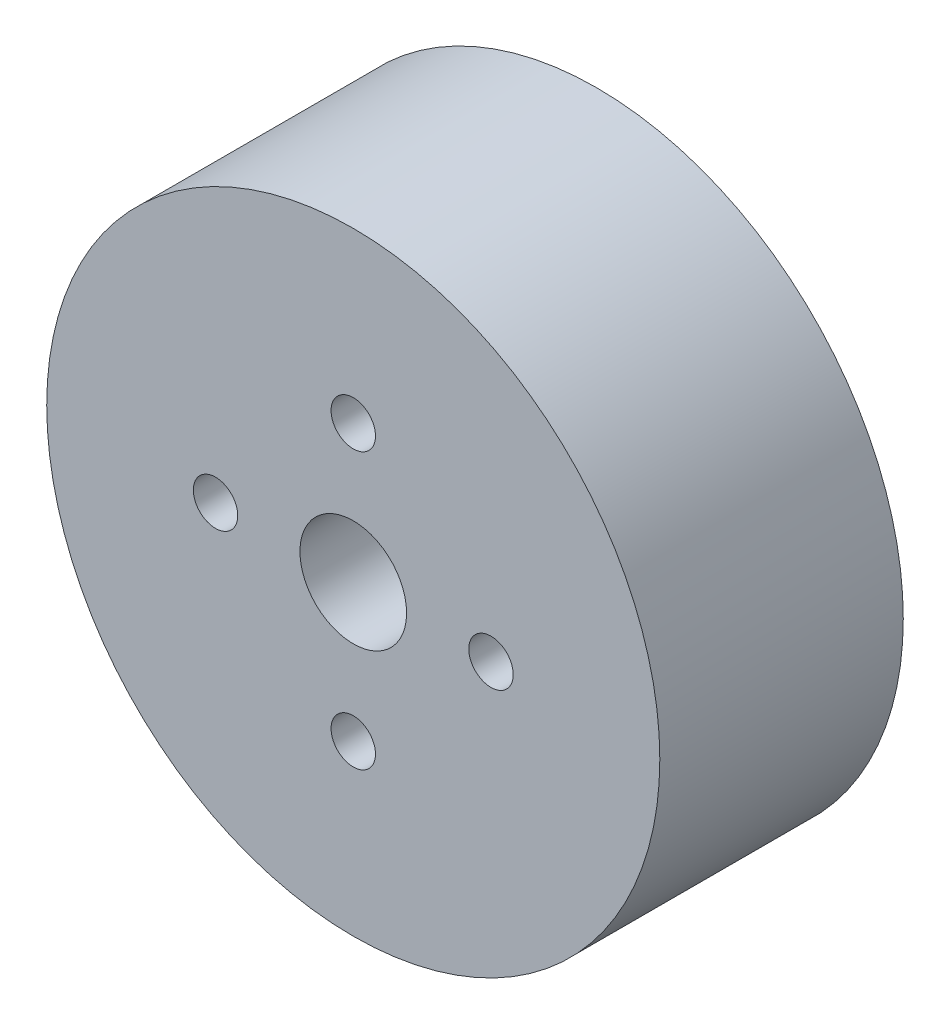
ISO-10303-21;
HEADER;
FILE_DESCRIPTION(('STEP AP214'),'2;1');
FILE_NAME('part.step','',(''),(''),'','','');
FILE_SCHEMA(('AUTOMOTIVE_DESIGN { 1 0 10303 214 1 1 1 1 }'));
ENDSEC;
DATA;
#1=APPLICATION_CONTEXT('core data for automotive mechanical design processes');
#2=APPLICATION_PROTOCOL_DEFINITION('international standard','automotive_design',2000,#1);
#3=PRODUCT_CONTEXT('',#1,'mechanical');
#4=PRODUCT('Part','Part','',(#3));
#5=PRODUCT_RELATED_PRODUCT_CATEGORY('part','',(#4));
#6=PRODUCT_DEFINITION_FORMATION('','',#4);
#7=PRODUCT_DEFINITION_CONTEXT('part definition',#1,'design');
#8=PRODUCT_DEFINITION('design','',#6,#7);
#9=PRODUCT_DEFINITION_SHAPE('','',#8);
#10=(LENGTH_UNIT() NAMED_UNIT(*) SI_UNIT(.MILLI.,.METRE.));
#11=(NAMED_UNIT(*) PLANE_ANGLE_UNIT() SI_UNIT($,.RADIAN.));
#12=(NAMED_UNIT(*) SI_UNIT($,.STERADIAN.) SOLID_ANGLE_UNIT());
#13=UNCERTAINTY_MEASURE_WITH_UNIT(LENGTH_MEASURE(1.E-05),#10,'distance_accuracy_value','');
#14=(GEOMETRIC_REPRESENTATION_CONTEXT(3) GLOBAL_UNCERTAINTY_ASSIGNED_CONTEXT((#13)) GLOBAL_UNIT_ASSIGNED_CONTEXT((#10,
#11,#12)) REPRESENTATION_CONTEXT('',''));
#15=CARTESIAN_POINT('',(0.,0.,0.));
#16=DIRECTION('',(0.,0.,1.));
#17=DIRECTION('',(1.,0.,0.));
#18=AXIS2_PLACEMENT_3D('',#15,#16,#17);
#19=CARTESIAN_POINT('',(0.,0.,13.7));
#20=DIRECTION('',(0.,0.,-1.));
#21=DIRECTION('',(-1.,0.,0.));
#22=AXIS2_PLACEMENT_3D('',#19,#20,#21);
#23=CYLINDRICAL_SURFACE('',#22,17.25);
#24=CARTESIAN_POINT('',(0.,0.,13.7));
#25=DIRECTION('',(0.,0.,1.));
#26=DIRECTION('',(1.,0.,0.));
#27=AXIS2_PLACEMENT_3D('',#24,#25,#26);
#28=CIRCLE('',#27,17.25);
#29=CARTESIAN_POINT('',(-17.25,0.,13.7));
#30=VERTEX_POINT('',#29);
#31=EDGE_CURVE('E63',#30,#30,#28,.T.);
#32=CARTESIAN_POINT('',(0.,0.,0.));
#33=DIRECTION('',(0.,0.,1.));
#34=DIRECTION('',(1.,0.,0.));
#35=AXIS2_PLACEMENT_3D('',#32,#33,#34);
#36=CIRCLE('',#35,17.25);
#37=CARTESIAN_POINT('',(-17.25,0.,0.));
#38=VERTEX_POINT('',#37);
#39=EDGE_CURVE('E64',#38,#38,#36,.T.);
#40=CARTESIAN_POINT('',(-17.25,0.,13.7));
#41=CARTESIAN_POINT('',(-17.25,0.,13.5572916666667));
#42=CARTESIAN_POINT('',(-17.25,0.,13.4145833333333));
#43=CARTESIAN_POINT('',(-17.25,0.,13.1291666666667));
#44=CARTESIAN_POINT('',(-17.25,0.,12.9864583333333));
#45=CARTESIAN_POINT('',(-17.25,0.,12.7010416666667));
#46=CARTESIAN_POINT('',(-17.25,0.,12.5583333333333));
#47=CARTESIAN_POINT('',(-17.25,0.,12.2729166666667));
#48=CARTESIAN_POINT('',(-17.25,0.,12.1302083333333));
#49=CARTESIAN_POINT('',(-17.25,0.,11.8447916666667));
#50=CARTESIAN_POINT('',(-17.25,0.,11.7020833333333));
#51=CARTESIAN_POINT('',(-17.25,0.,11.4166666666667));
#52=CARTESIAN_POINT('',(-17.25,0.,11.2739583333333));
#53=CARTESIAN_POINT('',(-17.25,0.,10.9885416666667));
#54=CARTESIAN_POINT('',(-17.25,0.,10.8458333333333));
#55=CARTESIAN_POINT('',(-17.25,0.,10.5604166666667));
#56=CARTESIAN_POINT('',(-17.25,0.,10.4177083333333));
#57=CARTESIAN_POINT('',(-17.25,0.,10.1322916666667));
#58=CARTESIAN_POINT('',(-17.25,0.,9.98958333333333));
#59=CARTESIAN_POINT('',(-17.25,0.,9.70416666666666));
#60=CARTESIAN_POINT('',(-17.25,0.,9.56145833333333));
#61=CARTESIAN_POINT('',(-17.25,0.,9.27604166666667));
#62=CARTESIAN_POINT('',(-17.25,0.,9.13333333333333));
#63=CARTESIAN_POINT('',(-17.25,0.,8.84791666666666));
#64=CARTESIAN_POINT('',(-17.25,0.,8.70520833333333));
#65=CARTESIAN_POINT('',(-17.25,0.,8.41979166666667));
#66=CARTESIAN_POINT('',(-17.25,0.,8.27708333333333));
#67=CARTESIAN_POINT('',(-17.25,0.,7.99166666666667));
#68=CARTESIAN_POINT('',(-17.25,0.,7.84895833333333));
#69=CARTESIAN_POINT('',(-17.25,0.,7.56354166666667));
#70=CARTESIAN_POINT('',(-17.25,0.,7.42083333333333));
#71=CARTESIAN_POINT('',(-17.25,0.,7.13541666666667));
#72=CARTESIAN_POINT('',(-17.25,0.,6.99270833333333));
#73=CARTESIAN_POINT('',(-17.25,0.,6.70729166666667));
#74=CARTESIAN_POINT('',(-17.25,0.,6.56458333333333));
#75=CARTESIAN_POINT('',(-17.25,0.,6.27916666666667));
#76=CARTESIAN_POINT('',(-17.25,0.,6.13645833333333));
#77=CARTESIAN_POINT('',(-17.25,0.,5.85104166666667));
#78=CARTESIAN_POINT('',(-17.25,0.,5.70833333333333));
#79=CARTESIAN_POINT('',(-17.25,0.,5.42291666666667));
#80=CARTESIAN_POINT('',(-17.25,0.,5.28020833333333));
#81=CARTESIAN_POINT('',(-17.25,0.,4.99479166666667));
#82=CARTESIAN_POINT('',(-17.25,0.,4.85208333333333));
#83=CARTESIAN_POINT('',(-17.25,0.,4.56666666666667));
#84=CARTESIAN_POINT('',(-17.25,0.,4.42395833333333));
#85=CARTESIAN_POINT('',(-17.25,0.,4.13854166666667));
#86=CARTESIAN_POINT('',(-17.25,0.,3.99583333333333));
#87=CARTESIAN_POINT('',(-17.25,0.,3.71041666666667));
#88=CARTESIAN_POINT('',(-17.25,0.,3.56770833333333));
#89=CARTESIAN_POINT('',(-17.25,0.,3.28229166666667));
#90=CARTESIAN_POINT('',(-17.25,0.,3.13958333333333));
#91=CARTESIAN_POINT('',(-17.25,0.,2.85416666666667));
#92=CARTESIAN_POINT('',(-17.25,0.,2.71145833333333));
#93=CARTESIAN_POINT('',(-17.25,0.,2.42604166666667));
#94=CARTESIAN_POINT('',(-17.25,0.,2.28333333333333));
#95=CARTESIAN_POINT('',(-17.25,0.,1.99791666666667));
#96=CARTESIAN_POINT('',(-17.25,0.,1.85520833333333));
#97=CARTESIAN_POINT('',(-17.25,0.,1.56979166666667));
#98=CARTESIAN_POINT('',(-17.25,0.,1.42708333333333));
#99=CARTESIAN_POINT('',(-17.25,0.,1.14166666666667));
#100=CARTESIAN_POINT('',(-17.25,0.,0.998958333333333));
#101=CARTESIAN_POINT('',(-17.25,0.,0.713541666666666));
#102=CARTESIAN_POINT('',(-17.25,0.,0.570833333333333));
#103=CARTESIAN_POINT('',(-17.25,0.,0.285416666666666));
#104=CARTESIAN_POINT('',(-17.25,0.,0.142708333333333));
#105=CARTESIAN_POINT('',(-17.25,0.,0.));
#106=B_SPLINE_CURVE_WITH_KNOTS('',3,(#40,#41,#42,#43,#44,#45,#46,#47,#48,#49,#50,#51,#52,#53,
#54,#55,#56,#57,#58,#59,#60,#61,#62,#63,#64,#65,#66,#67,#68,#69,#70,#71,#72,#73,#74,#75,#76,#77,
#78,#79,#80,#81,#82,#83,#84,#85,#86,#87,#88,#89,#90,#91,#92,#93,#94,#95,#96,#97,#98,#99,#100,
#101,#102,#103,#104,#105),.UNSPECIFIED.,.F.,.F.,(4,2,2,2,2,2,2,2,2,2,2,2,2,2,2,2,2,2,2,2,2,2,2,
2,2,2,2,2,2,2,2,2,4),(0.,0.428125,0.856249999999999,1.284375,1.7125,2.140625,2.56875,2.996875,
3.425,3.853125,4.28125,4.709375,5.1375,5.565625,5.99375,6.421875,6.85,7.278125,7.70625,8.134375,
8.5625,8.990625,9.41875,9.846875,10.275,10.703125,11.13125,11.559375,11.9875,12.415625,12.84375,
13.271875,13.7),.UNSPECIFIED.);
#107=EDGE_CURVE('BSEAM39',#30,#38,#106,.T.);
#108=ORIENTED_EDGE('',*,*,#31,.F.);
#109=ORIENTED_EDGE('',*,*,#39,.T.);
#110=ORIENTED_EDGE('',*,*,#107,.T.);
#111=ORIENTED_EDGE('',*,*,#107,.F.);
#112=EDGE_LOOP('',(#108,#110,#109,#111));
#113=FACE_BOUND('',#112,.T.);
#114=ADVANCED_FACE('F39',(#113),#23,.T.);
#115=CARTESIAN_POINT('',(0.,0.,13.7));
#116=DIRECTION('',(0.,0.,1.));
#117=DIRECTION('',(1.,0.,0.));
#118=AXIS2_PLACEMENT_3D('',#115,#116,#117);
#119=PLANE('',#118);
#120=CARTESIAN_POINT('',(0.,0.,13.7));
#121=DIRECTION('',(0.,0.,1.));
#122=DIRECTION('',(1.,0.,0.));
#123=AXIS2_PLACEMENT_3D('',#120,#121,#122);
#124=CIRCLE('',#123,3.);
#125=CARTESIAN_POINT('',(3.,0.,13.7));
#126=VERTEX_POINT('',#125);
#127=EDGE_CURVE('E152',#126,#126,#124,.T.);
#128=ORIENTED_EDGE('',*,*,#127,.F.);
#129=EDGE_LOOP('',(#128));
#130=FACE_BOUND('',#129,.T.);
#131=CARTESIAN_POINT('',(0.,7.75,13.7));
#132=DIRECTION('',(0.,0.,1.));
#133=DIRECTION('',(1.,0.,0.));
#134=AXIS2_PLACEMENT_3D('',#131,#132,#133);
#135=CIRCLE('',#134,1.25);
#136=CARTESIAN_POINT('',(1.25,7.75,13.7));
#137=VERTEX_POINT('',#136);
#138=EDGE_CURVE('E97',#137,#137,#135,.T.);
#139=ORIENTED_EDGE('',*,*,#138,.F.);
#140=EDGE_LOOP('',(#139));
#141=FACE_BOUND('',#140,.T.);
#142=CARTESIAN_POINT('',(7.75000000000022,2.18844596181622E-13,13.7));
#143=DIRECTION('',(0.,0.,1.));
#144=DIRECTION('',(1.,0.,0.));
#145=AXIS2_PLACEMENT_3D('',#142,#143,#144);
#146=CIRCLE('',#145,1.25000000000017);
#147=CARTESIAN_POINT('',(9.00000000000039,2.18844596181622E-13,13.7));
#148=VERTEX_POINT('',#147);
#149=EDGE_CURVE('E89',#148,#148,#146,.T.);
#150=ORIENTED_EDGE('',*,*,#149,.F.);
#151=EDGE_LOOP('',(#150));
#152=FACE_BOUND('',#151,.T.);
#153=CARTESIAN_POINT('',(4.37689192363245E-13,-7.75,13.7));
#154=DIRECTION('',(0.,0.,1.));
#155=DIRECTION('',(1.,0.,0.));
#156=AXIS2_PLACEMENT_3D('',#153,#154,#155);
#157=CIRCLE('',#156,1.25000000000047);
#158=CARTESIAN_POINT('',(1.25000000000091,-7.75,13.7));
#159=VERTEX_POINT('',#158);
#160=EDGE_CURVE('E81',#159,#159,#157,.T.);
#161=ORIENTED_EDGE('',*,*,#160,.F.);
#162=EDGE_LOOP('',(#161));
#163=FACE_BOUND('',#162,.T.);
#164=CARTESIAN_POINT('',(-7.74999999999978,-2.19793697450961E-13,13.7));
#165=DIRECTION('',(0.,0.,1.));
#166=DIRECTION('',(1.,0.,0.));
#167=AXIS2_PLACEMENT_3D('',#164,#165,#166);
#168=CIRCLE('',#167,1.25000000000035);
#169=CARTESIAN_POINT('',(-6.49999999999943,-2.19793697450961E-13,13.7));
#170=VERTEX_POINT('',#169);
#171=EDGE_CURVE('E72',#170,#170,#168,.T.);
#172=ORIENTED_EDGE('',*,*,#171,.F.);
#173=EDGE_LOOP('',(#172));
#174=FACE_BOUND('',#173,.T.);
#175=ORIENTED_EDGE('',*,*,#31,.T.);
#176=EDGE_LOOP('',(#175));
#177=FACE_BOUND('',#176,.T.);
#178=ADVANCED_FACE('F168',(#130,#141,#152,#163,#174,#177),#119,.T.);
#179=CARTESIAN_POINT('',(0.,0.,0.));
#180=DIRECTION('',(0.,0.,1.));
#181=DIRECTION('',(1.,0.,0.));
#182=AXIS2_PLACEMENT_3D('',#179,#180,#181);
#183=PLANE('',#182);
#184=CARTESIAN_POINT('',(0.,0.,0.));
#185=DIRECTION('',(0.,0.,1.));
#186=DIRECTION('',(1.,0.,0.));
#187=AXIS2_PLACEMENT_3D('',#184,#185,#186);
#188=CIRCLE('',#187,6.25);
#189=CARTESIAN_POINT('',(6.25,0.,0.));
#190=VERTEX_POINT('',#189);
#191=EDGE_CURVE('E136',#190,#190,#188,.T.);
#192=ORIENTED_EDGE('',*,*,#191,.T.);
#193=EDGE_LOOP('',(#192));
#194=FACE_BOUND('',#193,.T.);
#195=CARTESIAN_POINT('',(0.,7.75,0.));
#196=DIRECTION('',(0.,0.,1.));
#197=DIRECTION('',(1.,0.,0.));
#198=AXIS2_PLACEMENT_3D('',#195,#196,#197);
#199=CIRCLE('',#198,1.25);
#200=CARTESIAN_POINT('',(1.25,7.75,0.));
#201=VERTEX_POINT('',#200);
#202=EDGE_CURVE('E129',#201,#201,#199,.T.);
#203=ORIENTED_EDGE('',*,*,#202,.T.);
#204=EDGE_LOOP('',(#203));
#205=FACE_BOUND('',#204,.T.);
#206=CARTESIAN_POINT('',(7.75000000000022,2.18844596181622E-13,0.));
#207=DIRECTION('',(0.,0.,1.));
#208=DIRECTION('',(1.,0.,0.));
#209=AXIS2_PLACEMENT_3D('',#206,#207,#208);
#210=CIRCLE('',#209,1.25);
#211=CARTESIAN_POINT('',(9.00000000000022,2.18844596181622E-13,0.));
#212=VERTEX_POINT('',#211);
#213=EDGE_CURVE('E121',#212,#212,#210,.T.);
#214=ORIENTED_EDGE('',*,*,#213,.T.);
#215=EDGE_LOOP('',(#214));
#216=FACE_BOUND('',#215,.T.);
#217=CARTESIAN_POINT('',(4.37689192363245E-13,-7.75,0.));
#218=DIRECTION('',(0.,0.,1.));
#219=DIRECTION('',(1.,0.,0.));
#220=AXIS2_PLACEMENT_3D('',#217,#218,#219);
#221=CIRCLE('',#220,1.25);
#222=CARTESIAN_POINT('',(1.25000000000044,-7.75,0.));
#223=VERTEX_POINT('',#222);
#224=EDGE_CURVE('E113',#223,#223,#221,.T.);
#225=ORIENTED_EDGE('',*,*,#224,.T.);
#226=EDGE_LOOP('',(#225));
#227=FACE_BOUND('',#226,.T.);
#228=CARTESIAN_POINT('',(-7.74999999999978,-2.19793697450961E-13,0.));
#229=DIRECTION('',(0.,0.,1.));
#230=DIRECTION('',(1.,0.,0.));
#231=AXIS2_PLACEMENT_3D('',#228,#229,#230);
#232=CIRCLE('',#231,1.25);
#233=CARTESIAN_POINT('',(-6.49999999999978,-2.19793697450961E-13,0.));
#234=VERTEX_POINT('',#233);
#235=EDGE_CURVE('E104',#234,#234,#232,.T.);
#236=ORIENTED_EDGE('',*,*,#235,.T.);
#237=EDGE_LOOP('',(#236));
#238=FACE_BOUND('',#237,.T.);
#239=ORIENTED_EDGE('',*,*,#39,.F.);
#240=EDGE_LOOP('',(#239));
#241=FACE_BOUND('',#240,.T.);
#242=ADVANCED_FACE('F171',(#194,#205,#216,#227,#238,#241),#183,.F.);
#243=CARTESIAN_POINT('',(-7.74999999999978,-2.19793697450961E-13,10.7));
#244=DIRECTION('',(0.,0.,1.));
#245=DIRECTION('',(1.,0.,0.));
#246=AXIS2_PLACEMENT_3D('',#243,#244,#245);
#247=CYLINDRICAL_SURFACE('',#246,1.25000000000035);
#248=CARTESIAN_POINT('',(-7.74999999999978,-2.19793697450961E-13,10.7));
#249=DIRECTION('',(0.,0.,1.));
#250=DIRECTION('',(1.,0.,0.));
#251=AXIS2_PLACEMENT_3D('',#248,#249,#250);
#252=CIRCLE('',#251,1.25000000000035);
#253=CARTESIAN_POINT('',(-6.49999999999943,-2.19793697450961E-13,10.7));
#254=VERTEX_POINT('',#253);
#255=EDGE_CURVE('E76',#254,#254,#252,.T.);
#256=ORIENTED_EDGE('',*,*,#255,.F.);
#257=EDGE_LOOP('',(#256));
#258=FACE_BOUND('',#257,.T.);
#259=ORIENTED_EDGE('',*,*,#171,.T.);
#260=EDGE_LOOP('',(#259));
#261=FACE_BOUND('',#260,.T.);
#262=ADVANCED_FACE('F189',(#258,#261),#247,.F.);
#263=CARTESIAN_POINT('',(-7.74999999999978,-2.19793697450961E-13,10.7));
#264=DIRECTION('',(0.,0.,1.));
#265=DIRECTION('',(1.,0.,0.));
#266=AXIS2_PLACEMENT_3D('',#263,#264,#265);
#267=PLANE('',#266);
#268=ORIENTED_EDGE('',*,*,#255,.T.);
#269=EDGE_LOOP('',(#268));
#270=FACE_BOUND('',#269,.T.);
#271=ADVANCED_FACE('F196',(#270),#267,.T.);
#272=CARTESIAN_POINT('',(4.37689192363245E-13,-7.75,10.7));
#273=DIRECTION('',(0.,0.,1.));
#274=DIRECTION('',(1.,0.,0.));
#275=AXIS2_PLACEMENT_3D('',#272,#273,#274);
#276=CYLINDRICAL_SURFACE('',#275,1.25000000000047);
#277=CARTESIAN_POINT('',(4.37689192363245E-13,-7.75,10.7));
#278=DIRECTION('',(0.,0.,1.));
#279=DIRECTION('',(1.,0.,0.));
#280=AXIS2_PLACEMENT_3D('',#277,#278,#279);
#281=CIRCLE('',#280,1.25000000000047);
#282=CARTESIAN_POINT('',(1.25000000000091,-7.75,10.7));
#283=VERTEX_POINT('',#282);
#284=EDGE_CURVE('E85',#283,#283,#281,.T.);
#285=ORIENTED_EDGE('',*,*,#284,.F.);
#286=EDGE_LOOP('',(#285));
#287=FACE_BOUND('',#286,.T.);
#288=ORIENTED_EDGE('',*,*,#160,.T.);
#289=EDGE_LOOP('',(#288));
#290=FACE_BOUND('',#289,.T.);
#291=ADVANCED_FACE('F292',(#287,#290),#276,.F.);
#292=CARTESIAN_POINT('',(4.37689192363245E-13,-7.75,10.7));
#293=DIRECTION('',(0.,0.,1.));
#294=DIRECTION('',(1.,0.,0.));
#295=AXIS2_PLACEMENT_3D('',#292,#293,#294);
#296=PLANE('',#295);
#297=ORIENTED_EDGE('',*,*,#284,.T.);
#298=EDGE_LOOP('',(#297));
#299=FACE_BOUND('',#298,.T.);
#300=ADVANCED_FACE('F288',(#299),#296,.T.);
#301=CARTESIAN_POINT('',(7.75000000000022,2.18844596181622E-13,10.7));
#302=DIRECTION('',(0.,0.,1.));
#303=DIRECTION('',(1.,0.,0.));
#304=AXIS2_PLACEMENT_3D('',#301,#302,#303);
#305=CYLINDRICAL_SURFACE('',#304,1.25000000000017);
#306=CARTESIAN_POINT('',(7.75000000000022,2.18844596181622E-13,10.7));
#307=DIRECTION('',(0.,0.,1.));
#308=DIRECTION('',(1.,0.,0.));
#309=AXIS2_PLACEMENT_3D('',#306,#307,#308);
#310=CIRCLE('',#309,1.25000000000017);
#311=CARTESIAN_POINT('',(9.00000000000039,2.18844596181622E-13,10.7));
#312=VERTEX_POINT('',#311);
#313=EDGE_CURVE('E93',#312,#312,#310,.T.);
#314=ORIENTED_EDGE('',*,*,#313,.F.);
#315=EDGE_LOOP('',(#314));
#316=FACE_BOUND('',#315,.T.);
#317=ORIENTED_EDGE('',*,*,#149,.T.);
#318=EDGE_LOOP('',(#317));
#319=FACE_BOUND('',#318,.T.);
#320=ADVANCED_FACE('F284',(#316,#319),#305,.F.);
#321=CARTESIAN_POINT('',(7.75000000000022,2.18844596181622E-13,10.7));
#322=DIRECTION('',(0.,0.,1.));
#323=DIRECTION('',(1.,0.,0.));
#324=AXIS2_PLACEMENT_3D('',#321,#322,#323);
#325=PLANE('',#324);
#326=ORIENTED_EDGE('',*,*,#313,.T.);
#327=EDGE_LOOP('',(#326));
#328=FACE_BOUND('',#327,.T.);
#329=ADVANCED_FACE('F280',(#328),#325,.T.);
#330=CARTESIAN_POINT('',(0.,7.75,10.7));
#331=DIRECTION('',(0.,0.,1.));
#332=DIRECTION('',(1.,0.,0.));
#333=AXIS2_PLACEMENT_3D('',#330,#331,#332);
#334=CYLINDRICAL_SURFACE('',#333,1.25);
#335=CARTESIAN_POINT('',(0.,7.75,10.7));
#336=DIRECTION('',(0.,0.,1.));
#337=DIRECTION('',(1.,0.,0.));
#338=AXIS2_PLACEMENT_3D('',#335,#336,#337);
#339=CIRCLE('',#338,1.25);
#340=CARTESIAN_POINT('',(1.25,7.75,10.7));
#341=VERTEX_POINT('',#340);
#342=EDGE_CURVE('E68',#341,#341,#339,.T.);
#343=ORIENTED_EDGE('',*,*,#342,.F.);
#344=EDGE_LOOP('',(#343));
#345=FACE_BOUND('',#344,.T.);
#346=ORIENTED_EDGE('',*,*,#138,.T.);
#347=EDGE_LOOP('',(#346));
#348=FACE_BOUND('',#347,.T.);
#349=ADVANCED_FACE('F276',(#345,#348),#334,.F.);
#350=CARTESIAN_POINT('',(0.,7.75,10.7));
#351=DIRECTION('',(0.,0.,1.));
#352=DIRECTION('',(1.,0.,0.));
#353=AXIS2_PLACEMENT_3D('',#350,#351,#352);
#354=PLANE('',#353);
#355=ORIENTED_EDGE('',*,*,#342,.T.);
#356=EDGE_LOOP('',(#355));
#357=FACE_BOUND('',#356,.T.);
#358=ADVANCED_FACE('F272',(#357),#354,.T.);
#359=CARTESIAN_POINT('',(-7.74999999999978,-2.19793697450961E-13,3.));
#360=DIRECTION('',(0.,0.,-1.));
#361=DIRECTION('',(-1.,0.,0.));
#362=AXIS2_PLACEMENT_3D('',#359,#360,#361);
#363=CYLINDRICAL_SURFACE('',#362,1.25);
#364=CARTESIAN_POINT('',(-7.74999999999978,-2.19793697450961E-13,3.));
#365=DIRECTION('',(0.,0.,1.));
#366=DIRECTION('',(1.,0.,0.));
#367=AXIS2_PLACEMENT_3D('',#364,#365,#366);
#368=CIRCLE('',#367,1.25);
#369=CARTESIAN_POINT('',(-6.49999999999978,-2.19793697450961E-13,3.));
#370=VERTEX_POINT('',#369);
#371=EDGE_CURVE('E108',#370,#370,#368,.T.);
#372=ORIENTED_EDGE('',*,*,#371,.T.);
#373=EDGE_LOOP('',(#372));
#374=FACE_BOUND('',#373,.T.);
#375=ORIENTED_EDGE('',*,*,#235,.F.);
#376=EDGE_LOOP('',(#375));
#377=FACE_BOUND('',#376,.T.);
#378=ADVANCED_FACE('F268',(#374,#377),#363,.F.);
#379=CARTESIAN_POINT('',(-7.74999999999978,-2.19793697450961E-13,3.));
#380=DIRECTION('',(0.,0.,1.));
#381=DIRECTION('',(1.,0.,0.));
#382=AXIS2_PLACEMENT_3D('',#379,#380,#381);
#383=PLANE('',#382);
#384=ORIENTED_EDGE('',*,*,#371,.F.);
#385=EDGE_LOOP('',(#384));
#386=FACE_BOUND('',#385,.T.);
#387=ADVANCED_FACE('F264',(#386),#383,.F.);
#388=CARTESIAN_POINT('',(4.37689192363245E-13,-7.75,3.));
#389=DIRECTION('',(0.,0.,-1.));
#390=DIRECTION('',(-1.,0.,0.));
#391=AXIS2_PLACEMENT_3D('',#388,#389,#390);
#392=CYLINDRICAL_SURFACE('',#391,1.25);
#393=CARTESIAN_POINT('',(4.37689192363245E-13,-7.75,3.));
#394=DIRECTION('',(0.,0.,1.));
#395=DIRECTION('',(1.,0.,0.));
#396=AXIS2_PLACEMENT_3D('',#393,#394,#395);
#397=CIRCLE('',#396,1.25);
#398=CARTESIAN_POINT('',(1.25000000000044,-7.75,3.));
#399=VERTEX_POINT('',#398);
#400=EDGE_CURVE('E117',#399,#399,#397,.T.);
#401=ORIENTED_EDGE('',*,*,#400,.T.);
#402=EDGE_LOOP('',(#401));
#403=FACE_BOUND('',#402,.T.);
#404=ORIENTED_EDGE('',*,*,#224,.F.);
#405=EDGE_LOOP('',(#404));
#406=FACE_BOUND('',#405,.T.);
#407=ADVANCED_FACE('F260',(#403,#406),#392,.F.);
#408=CARTESIAN_POINT('',(4.37689192363245E-13,-7.75,3.));
#409=DIRECTION('',(0.,0.,1.));
#410=DIRECTION('',(1.,0.,0.));
#411=AXIS2_PLACEMENT_3D('',#408,#409,#410);
#412=PLANE('',#411);
#413=ORIENTED_EDGE('',*,*,#400,.F.);
#414=EDGE_LOOP('',(#413));
#415=FACE_BOUND('',#414,.T.);
#416=ADVANCED_FACE('F256',(#415),#412,.F.);
#417=CARTESIAN_POINT('',(7.75000000000022,2.18844596181622E-13,3.));
#418=DIRECTION('',(0.,0.,-1.));
#419=DIRECTION('',(-1.,0.,0.));
#420=AXIS2_PLACEMENT_3D('',#417,#418,#419);
#421=CYLINDRICAL_SURFACE('',#420,1.25);
#422=CARTESIAN_POINT('',(7.75000000000022,2.18844596181622E-13,3.));
#423=DIRECTION('',(0.,0.,1.));
#424=DIRECTION('',(1.,0.,0.));
#425=AXIS2_PLACEMENT_3D('',#422,#423,#424);
#426=CIRCLE('',#425,1.25);
#427=CARTESIAN_POINT('',(9.00000000000022,2.18844596181622E-13,3.));
#428=VERTEX_POINT('',#427);
#429=EDGE_CURVE('E125',#428,#428,#426,.T.);
#430=ORIENTED_EDGE('',*,*,#429,.T.);
#431=EDGE_LOOP('',(#430));
#432=FACE_BOUND('',#431,.T.);
#433=ORIENTED_EDGE('',*,*,#213,.F.);
#434=EDGE_LOOP('',(#433));
#435=FACE_BOUND('',#434,.T.);
#436=ADVANCED_FACE('F252',(#432,#435),#421,.F.);
#437=CARTESIAN_POINT('',(7.75000000000022,2.18844596181622E-13,3.));
#438=DIRECTION('',(0.,0.,1.));
#439=DIRECTION('',(1.,0.,0.));
#440=AXIS2_PLACEMENT_3D('',#437,#438,#439);
#441=PLANE('',#440);
#442=ORIENTED_EDGE('',*,*,#429,.F.);
#443=EDGE_LOOP('',(#442));
#444=FACE_BOUND('',#443,.T.);
#445=ADVANCED_FACE('F248',(#444),#441,.F.);
#446=CARTESIAN_POINT('',(0.,7.75,3.));
#447=DIRECTION('',(0.,0.,-1.));
#448=DIRECTION('',(-1.,0.,0.));
#449=AXIS2_PLACEMENT_3D('',#446,#447,#448);
#450=CYLINDRICAL_SURFACE('',#449,1.25);
#451=CARTESIAN_POINT('',(0.,7.75,3.));
#452=DIRECTION('',(0.,0.,1.));
#453=DIRECTION('',(1.,0.,0.));
#454=AXIS2_PLACEMENT_3D('',#451,#452,#453);
#455=CIRCLE('',#454,1.25);
#456=CARTESIAN_POINT('',(1.25,7.75,3.));
#457=VERTEX_POINT('',#456);
#458=EDGE_CURVE('E77',#457,#457,#455,.T.);
#459=ORIENTED_EDGE('',*,*,#458,.T.);
#460=EDGE_LOOP('',(#459));
#461=FACE_BOUND('',#460,.T.);
#462=ORIENTED_EDGE('',*,*,#202,.F.);
#463=EDGE_LOOP('',(#462));
#464=FACE_BOUND('',#463,.T.);
#465=ADVANCED_FACE('F244',(#461,#464),#450,.F.);
#466=CARTESIAN_POINT('',(0.,7.75,3.));
#467=DIRECTION('',(0.,0.,1.));
#468=DIRECTION('',(1.,0.,0.));
#469=AXIS2_PLACEMENT_3D('',#466,#467,#468);
#470=PLANE('',#469);
#471=ORIENTED_EDGE('',*,*,#458,.F.);
#472=EDGE_LOOP('',(#471));
#473=FACE_BOUND('',#472,.T.);
#474=ADVANCED_FACE('F237',(#473),#470,.F.);
#475=CARTESIAN_POINT('',(0.,0.,2.));
#476=DIRECTION('',(0.,0.,1.));
#477=DIRECTION('',(1.,0.,0.));
#478=AXIS2_PLACEMENT_3D('',#475,#476,#477);
#479=PLANE('',#478);
#480=CARTESIAN_POINT('',(0.,0.,2.));
#481=DIRECTION('',(0.,0.,1.));
#482=DIRECTION('',(1.,0.,0.));
#483=AXIS2_PLACEMENT_3D('',#480,#481,#482);
#484=CIRCLE('',#483,6.25);
#485=CARTESIAN_POINT('',(6.25,0.,2.));
#486=VERTEX_POINT('',#485);
#487=EDGE_CURVE('E109',#486,#486,#484,.T.);
#488=ORIENTED_EDGE('',*,*,#487,.F.);
#489=EDGE_LOOP('',(#488));
#490=FACE_BOUND('',#489,.T.);
#491=CARTESIAN_POINT('',(0.,0.,2.));
#492=DIRECTION('',(0.,0.,1.));
#493=DIRECTION('',(1.,0.,0.));
#494=AXIS2_PLACEMENT_3D('',#491,#492,#493);
#495=CIRCLE('',#494,4.25);
#496=CARTESIAN_POINT('',(4.25,0.,2.));
#497=VERTEX_POINT('',#496);
#498=EDGE_CURVE('E140',#497,#497,#495,.T.);
#499=ORIENTED_EDGE('',*,*,#498,.T.);
#500=EDGE_LOOP('',(#499));
#501=FACE_BOUND('',#500,.T.);
#502=ADVANCED_FACE('F234',(#490,#501),#479,.F.);
#503=CARTESIAN_POINT('',(0.,0.,2.));
#504=DIRECTION('',(0.,0.,-1.));
#505=DIRECTION('',(-1.,0.,0.));
#506=AXIS2_PLACEMENT_3D('',#503,#504,#505);
#507=CYLINDRICAL_SURFACE('',#506,6.25);
#508=ORIENTED_EDGE('',*,*,#487,.T.);
#509=EDGE_LOOP('',(#508));
#510=FACE_BOUND('',#509,.T.);
#511=ORIENTED_EDGE('',*,*,#191,.F.);
#512=EDGE_LOOP('',(#511));
#513=FACE_BOUND('',#512,.T.);
#514=ADVANCED_FACE('F210',(#510,#513),#507,.F.);
#515=CARTESIAN_POINT('',(0.,0.,2.));
#516=DIRECTION('',(0.,0.,-1.));
#517=DIRECTION('',(-1.,0.,0.));
#518=AXIS2_PLACEMENT_3D('',#515,#516,#517);
#519=CYLINDRICAL_SURFACE('',#518,4.25);
#520=CARTESIAN_POINT('',(0.,0.,0.3));
#521=DIRECTION('',(0.,0.,1.));
#522=DIRECTION('',(1.,0.,0.));
#523=AXIS2_PLACEMENT_3D('',#520,#521,#522);
#524=CIRCLE('',#523,4.25);
#525=CARTESIAN_POINT('',(4.25,0.,0.3));
#526=VERTEX_POINT('',#525);
#527=EDGE_CURVE('E10',#526,#526,#524,.T.);
#528=ORIENTED_EDGE('',*,*,#527,.T.);
#529=EDGE_LOOP('',(#528));
#530=FACE_BOUND('',#529,.T.);
#531=ORIENTED_EDGE('',*,*,#498,.F.);
#532=EDGE_LOOP('',(#531));
#533=FACE_BOUND('',#532,.T.);
#534=ADVANCED_FACE('F202',(#530,#533),#519,.T.);
#535=CARTESIAN_POINT('',(0.,0.,0.));
#536=DIRECTION('',(0.,0.,1.));
#537=DIRECTION('',(1.,0.,0.));
#538=AXIS2_PLACEMENT_3D('',#535,#536,#537);
#539=CIRCLE('',#538,3.55);
#540=CARTESIAN_POINT('',(3.55,0.,0.));
#541=VERTEX_POINT('',#540);
#542=EDGE_CURVE('E52',#541,#541,#539,.T.);
#543=ORIENTED_EDGE('',*,*,#542,.T.);
#544=EDGE_LOOP('',(#543));
#545=FACE_BOUND('',#544,.T.);
#546=CARTESIAN_POINT('',(0.,0.,0.));
#547=DIRECTION('',(0.,0.,1.));
#548=DIRECTION('',(1.,0.,0.));
#549=AXIS2_PLACEMENT_3D('',#546,#547,#548);
#550=CIRCLE('',#549,3.95);
#551=CARTESIAN_POINT('',(3.95,0.,0.));
#552=VERTEX_POINT('',#551);
#553=EDGE_CURVE('E57',#552,#552,#550,.F.);
#554=ORIENTED_EDGE('',*,*,#553,.T.);
#555=EDGE_LOOP('',(#554));
#556=FACE_BOUND('',#555,.T.);
#557=ADVANCED_FACE('F192',(#545,#556),#183,.F.);
#558=CARTESIAN_POINT('',(0.,0.,0.7));
#559=DIRECTION('',(0.,0.,-1.));
#560=DIRECTION('',(-1.,0.,0.));
#561=AXIS2_PLACEMENT_3D('',#558,#559,#560);
#562=CYLINDRICAL_SURFACE('',#561,3.25);
#563=CARTESIAN_POINT('',(0.,0.,0.3));
#564=DIRECTION('',(0.,0.,1.));
#565=DIRECTION('',(1.,0.,0.));
#566=AXIS2_PLACEMENT_3D('',#563,#564,#565);
#567=CIRCLE('',#566,3.25);
#568=CARTESIAN_POINT('',(3.25,0.,0.3));
#569=VERTEX_POINT('',#568);
#570=EDGE_CURVE('E47',#569,#569,#567,.F.);
#571=ORIENTED_EDGE('',*,*,#570,.T.);
#572=EDGE_LOOP('',(#571));
#573=FACE_BOUND('',#572,.T.);
#574=CARTESIAN_POINT('',(0.,0.,0.7));
#575=DIRECTION('',(0.,0.,1.));
#576=DIRECTION('',(1.,0.,0.));
#577=AXIS2_PLACEMENT_3D('',#574,#575,#576);
#578=CIRCLE('',#577,3.25);
#579=CARTESIAN_POINT('',(3.25,0.,0.7));
#580=VERTEX_POINT('',#579);
#581=EDGE_CURVE('E147',#580,#580,#578,.T.);
#582=ORIENTED_EDGE('',*,*,#581,.T.);
#583=EDGE_LOOP('',(#582));
#584=FACE_BOUND('',#583,.T.);
#585=ADVANCED_FACE('F201',(#573,#584),#562,.F.);
#586=CARTESIAN_POINT('',(0.,0.,0.7));
#587=DIRECTION('',(0.,0.,1.));
#588=DIRECTION('',(1.,0.,0.));
#589=AXIS2_PLACEMENT_3D('',#586,#587,#588);
#590=PLANE('',#589);
#591=ORIENTED_EDGE('',*,*,#581,.F.);
#592=EDGE_LOOP('',(#591));
#593=FACE_BOUND('',#592,.T.);
#594=ADVANCED_FACE('F208',(#593),#590,.F.);
#595=CARTESIAN_POINT('',(0.,0.,0.3));
#596=DIRECTION('',(0.,0.,1.));
#597=DIRECTION('',(1.,0.,0.));
#598=AXIS2_PLACEMENT_3D('',#595,#596,#597);
#599=TOROIDAL_SURFACE('',#598,3.55,0.3);
#600=ORIENTED_EDGE('',*,*,#570,.F.);
#601=EDGE_LOOP('',(#600));
#602=FACE_BOUND('',#601,.T.);
#603=ORIENTED_EDGE('',*,*,#542,.F.);
#604=EDGE_LOOP('',(#603));
#605=FACE_BOUND('',#604,.T.);
#606=ADVANCED_FACE('F218',(#602,#605),#599,.T.);
#607=CARTESIAN_POINT('',(0.,0.,0.3));
#608=DIRECTION('',(0.,0.,1.));
#609=DIRECTION('',(1.,0.,0.));
#610=AXIS2_PLACEMENT_3D('',#607,#608,#609);
#611=TOROIDAL_SURFACE('',#610,3.95,0.3);
#612=ORIENTED_EDGE('',*,*,#553,.F.);
#613=EDGE_LOOP('',(#612));
#614=FACE_BOUND('',#613,.T.);
#615=ORIENTED_EDGE('',*,*,#527,.F.);
#616=EDGE_LOOP('',(#615));
#617=FACE_BOUND('',#616,.T.);
#618=ADVANCED_FACE('F41',(#614,#617),#611,.T.);
#619=CARTESIAN_POINT('',(0.,0.,2.7));
#620=DIRECTION('',(0.,0.,1.));
#621=DIRECTION('',(1.,0.,0.));
#622=AXIS2_PLACEMENT_3D('',#619,#620,#621);
#623=CYLINDRICAL_SURFACE('',#622,3.);
#624=CARTESIAN_POINT('',(0.,0.,2.7));
#625=DIRECTION('',(0.,0.,1.));
#626=DIRECTION('',(1.,0.,0.));
#627=AXIS2_PLACEMENT_3D('',#624,#625,#626);
#628=CIRCLE('',#627,3.);
#629=CARTESIAN_POINT('',(3.,0.,2.7));
#630=VERTEX_POINT('',#629);
#631=EDGE_CURVE('E151',#630,#630,#628,.T.);
#632=ORIENTED_EDGE('',*,*,#631,.F.);
#633=EDGE_LOOP('',(#632));
#634=FACE_BOUND('',#633,.T.);
#635=ORIENTED_EDGE('',*,*,#127,.T.);
#636=EDGE_LOOP('',(#635));
#637=FACE_BOUND('',#636,.T.);
#638=ADVANCED_FACE('F162',(#634,#637),#623,.F.);
#639=CARTESIAN_POINT('',(0.,0.,2.7));
#640=DIRECTION('',(0.,0.,1.));
#641=DIRECTION('',(1.,0.,0.));
#642=AXIS2_PLACEMENT_3D('',#639,#640,#641);
#643=PLANE('',#642);
#644=ORIENTED_EDGE('',*,*,#631,.T.);
#645=EDGE_LOOP('',(#644));
#646=FACE_BOUND('',#645,.T.);
#647=ADVANCED_FACE('F160',(#646),#643,.T.);
#648=CLOSED_SHELL('',(#114,#178,#242,#262,#271,#291,#300,#320,#329,#349,#358,#378,#387,#407,
#416,#436,#445,#465,#474,#502,#514,#534,#557,#585,#594,#606,#618,#638,#647));
#649=MANIFOLD_SOLID_BREP('B2',#648);
#650=ADVANCED_BREP_SHAPE_REPRESENTATION('',(#18,#649),#14);
#651=SHAPE_DEFINITION_REPRESENTATION(#9,#650);
ENDSEC;
END-ISO-10303-21;
